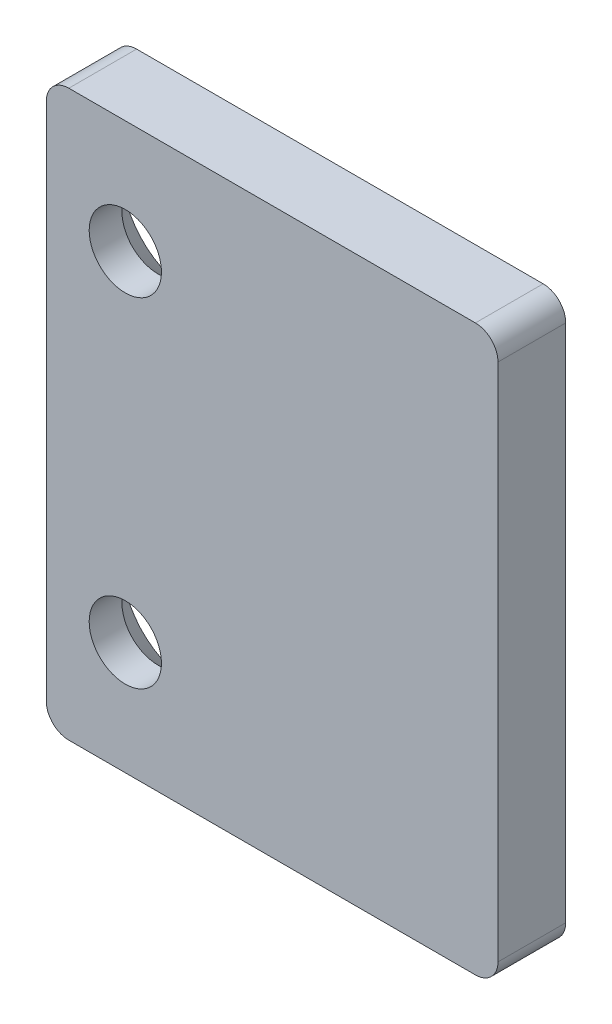
ISO-10303-21;
HEADER;
FILE_DESCRIPTION(('STEP AP214'),'2;1');
FILE_NAME('part.step','',(''),(''),'','','');
FILE_SCHEMA(('AUTOMOTIVE_DESIGN { 1 0 10303 214 1 1 1 1 }'));
ENDSEC;
DATA;
#1=APPLICATION_CONTEXT('core data for automotive mechanical design processes');
#2=APPLICATION_PROTOCOL_DEFINITION('international standard','automotive_design',2000,#1);
#3=PRODUCT_CONTEXT('',#1,'mechanical');
#4=PRODUCT('Part','Part','',(#3));
#5=PRODUCT_RELATED_PRODUCT_CATEGORY('part','',(#4));
#6=PRODUCT_DEFINITION_FORMATION('','',#4);
#7=PRODUCT_DEFINITION_CONTEXT('part definition',#1,'design');
#8=PRODUCT_DEFINITION('design','',#6,#7);
#9=PRODUCT_DEFINITION_SHAPE('','',#8);
#10=(LENGTH_UNIT() NAMED_UNIT(*) SI_UNIT(.MILLI.,.METRE.));
#11=(NAMED_UNIT(*) PLANE_ANGLE_UNIT() SI_UNIT($,.RADIAN.));
#12=(NAMED_UNIT(*) SI_UNIT($,.STERADIAN.) SOLID_ANGLE_UNIT());
#13=UNCERTAINTY_MEASURE_WITH_UNIT(LENGTH_MEASURE(1.E-05),#10,'distance_accuracy_value','');
#14=(GEOMETRIC_REPRESENTATION_CONTEXT(3) GLOBAL_UNCERTAINTY_ASSIGNED_CONTEXT((#13)) GLOBAL_UNIT_ASSIGNED_CONTEXT((#10,
#11,#12)) REPRESENTATION_CONTEXT('',''));
#15=CARTESIAN_POINT('',(0.,0.,0.));
#16=DIRECTION('',(0.,0.,1.));
#17=DIRECTION('',(1.,0.,0.));
#18=AXIS2_PLACEMENT_3D('',#15,#16,#17);
#19=CARTESIAN_POINT('',(0.,0.,3.));
#20=DIRECTION('',(0.,0.,-1.));
#21=DIRECTION('',(-1.,0.,0.));
#22=AXIS2_PLACEMENT_3D('',#19,#20,#21);
#23=PLANE('',#22);
#24=DIRECTION('',(-1.,0.,0.));
#25=VECTOR('',#24,1.);
#26=CARTESIAN_POINT('',(0.,25.,3.));
#27=LINE('',#26,#25);
#28=CARTESIAN_POINT('',(19.,25.,3.));
#29=VERTEX_POINT('',#28);
#30=CARTESIAN_POINT('',(1.,25.,3.));
#31=VERTEX_POINT('',#30);
#32=EDGE_CURVE('E136',#29,#31,#27,.T.);
#33=ORIENTED_EDGE('',*,*,#32,.T.);
#34=CARTESIAN_POINT('',(1.,24.,3.));
#35=DIRECTION('',(0.,0.,-1.));
#36=DIRECTION('',(-1.,0.,0.));
#37=AXIS2_PLACEMENT_3D('',#34,#35,#36);
#38=CIRCLE('',#37,1.);
#39=CARTESIAN_POINT('',(0.,24.,3.));
#40=VERTEX_POINT('',#39);
#41=EDGE_CURVE('E154',#31,#40,#38,.F.);
#42=ORIENTED_EDGE('',*,*,#41,.T.);
#43=DIRECTION('',(0.,-1.,0.));
#44=VECTOR('',#43,1.);
#45=CARTESIAN_POINT('',(0.,0.,3.));
#46=LINE('',#45,#44);
#47=CARTESIAN_POINT('',(0.,1.,3.));
#48=VERTEX_POINT('',#47);
#49=EDGE_CURVE('E119',#40,#48,#46,.T.);
#50=ORIENTED_EDGE('',*,*,#49,.T.);
#51=CARTESIAN_POINT('',(1.,1.,3.));
#52=DIRECTION('',(0.,0.,-1.));
#53=DIRECTION('',(-1.,0.,0.));
#54=AXIS2_PLACEMENT_3D('',#51,#52,#53);
#55=CIRCLE('',#54,1.);
#56=CARTESIAN_POINT('',(1.,0.,3.));
#57=VERTEX_POINT('',#56);
#58=EDGE_CURVE('E150',#48,#57,#55,.F.);
#59=ORIENTED_EDGE('',*,*,#58,.T.);
#60=DIRECTION('',(1.,0.,0.));
#61=VECTOR('',#60,1.);
#62=CARTESIAN_POINT('',(0.,0.,3.));
#63=LINE('',#62,#61);
#64=CARTESIAN_POINT('',(19.,0.,3.));
#65=VERTEX_POINT('',#64);
#66=EDGE_CURVE('E163',#57,#65,#63,.T.);
#67=ORIENTED_EDGE('',*,*,#66,.T.);
#68=CARTESIAN_POINT('',(19.,1.,3.));
#69=DIRECTION('',(0.,0.,-1.));
#70=DIRECTION('',(-1.,0.,0.));
#71=AXIS2_PLACEMENT_3D('',#68,#69,#70);
#72=CIRCLE('',#71,1.);
#73=CARTESIAN_POINT('',(20.,1.,3.));
#74=VERTEX_POINT('',#73);
#75=EDGE_CURVE('E54',#65,#74,#72,.F.);
#76=ORIENTED_EDGE('',*,*,#75,.T.);
#77=DIRECTION('',(0.,1.,0.));
#78=VECTOR('',#77,1.);
#79=CARTESIAN_POINT('',(20.,0.,3.));
#80=LINE('',#79,#78);
#81=CARTESIAN_POINT('',(20.,24.,3.));
#82=VERTEX_POINT('',#81);
#83=EDGE_CURVE('E169',#74,#82,#80,.T.);
#84=ORIENTED_EDGE('',*,*,#83,.T.);
#85=CARTESIAN_POINT('',(19.,24.,3.));
#86=DIRECTION('',(0.,0.,-1.));
#87=DIRECTION('',(-1.,0.,0.));
#88=AXIS2_PLACEMENT_3D('',#85,#86,#87);
#89=CIRCLE('',#88,1.);
#90=EDGE_CURVE('E152',#82,#29,#89,.F.);
#91=ORIENTED_EDGE('',*,*,#90,.T.);
#92=EDGE_LOOP('',(#33,#42,#50,#59,#67,#76,#84,#91));
#93=FACE_BOUND('',#92,.T.);
#94=CARTESIAN_POINT('',(3.5,5.,3.));
#95=DIRECTION('',(0.,0.,1.));
#96=DIRECTION('',(1.,0.,0.));
#97=AXIS2_PLACEMENT_3D('',#94,#95,#96);
#98=CIRCLE('',#97,1.6);
#99=CARTESIAN_POINT('',(5.1,5.,3.));
#100=VERTEX_POINT('',#99);
#101=EDGE_CURVE('E127',#100,#100,#98,.T.);
#102=ORIENTED_EDGE('',*,*,#101,.F.);
#103=EDGE_LOOP('',(#102));
#104=FACE_BOUND('',#103,.T.);
#105=CARTESIAN_POINT('',(3.5,20.,3.));
#106=DIRECTION('',(0.,0.,1.));
#107=DIRECTION('',(1.,0.,0.));
#108=AXIS2_PLACEMENT_3D('',#105,#106,#107);
#109=CIRCLE('',#108,1.6);
#110=CARTESIAN_POINT('',(5.1,20.,3.));
#111=VERTEX_POINT('',#110);
#112=EDGE_CURVE('E133',#111,#111,#109,.T.);
#113=ORIENTED_EDGE('',*,*,#112,.F.);
#114=EDGE_LOOP('',(#113));
#115=FACE_BOUND('',#114,.T.);
#116=ADVANCED_FACE('F32',(#93,#104,#115),#23,.F.);
#117=CARTESIAN_POINT('',(0.,0.,0.));
#118=DIRECTION('',(0.,0.,-1.));
#119=DIRECTION('',(-1.,0.,0.));
#120=AXIS2_PLACEMENT_3D('',#117,#118,#119);
#121=PLANE('',#120);
#122=CARTESIAN_POINT('',(3.5,20.,0.));
#123=DIRECTION('',(0.,0.,-1.));
#124=DIRECTION('',(-1.,0.,0.));
#125=AXIS2_PLACEMENT_3D('',#122,#123,#124);
#126=CIRCLE('',#125,3.15);
#127=CARTESIAN_POINT('',(0.350000000000001,20.,0.));
#128=VERTEX_POINT('',#127);
#129=EDGE_CURVE('E194',#128,#128,#126,.T.);
#130=ORIENTED_EDGE('',*,*,#129,.F.);
#131=EDGE_LOOP('',(#130));
#132=FACE_BOUND('',#131,.T.);
#133=CARTESIAN_POINT('',(3.5,5.,0.));
#134=DIRECTION('',(0.,0.,-1.));
#135=DIRECTION('',(-1.,0.,0.));
#136=AXIS2_PLACEMENT_3D('',#133,#134,#135);
#137=CIRCLE('',#136,3.15);
#138=CARTESIAN_POINT('',(0.350000000000004,5.,0.));
#139=VERTEX_POINT('',#138);
#140=EDGE_CURVE('E188',#139,#139,#137,.T.);
#141=ORIENTED_EDGE('',*,*,#140,.F.);
#142=EDGE_LOOP('',(#141));
#143=FACE_BOUND('',#142,.T.);
#144=DIRECTION('',(0.,-1.,0.));
#145=VECTOR('',#144,1.);
#146=CARTESIAN_POINT('',(0.,0.,0.));
#147=LINE('',#146,#145);
#148=CARTESIAN_POINT('',(0.,24.,0.));
#149=VERTEX_POINT('',#148);
#150=CARTESIAN_POINT('',(0.,1.,0.));
#151=VERTEX_POINT('',#150);
#152=EDGE_CURVE('E116',#149,#151,#147,.T.);
#153=ORIENTED_EDGE('',*,*,#152,.F.);
#154=CARTESIAN_POINT('',(1.,24.,0.));
#155=DIRECTION('',(0.,0.,-1.));
#156=DIRECTION('',(-1.,0.,0.));
#157=AXIS2_PLACEMENT_3D('',#154,#155,#156);
#158=CIRCLE('',#157,1.);
#159=CARTESIAN_POINT('',(1.,25.,0.));
#160=VERTEX_POINT('',#159);
#161=EDGE_CURVE('E99',#149,#160,#158,.T.);
#162=ORIENTED_EDGE('',*,*,#161,.T.);
#163=DIRECTION('',(-1.,0.,0.));
#164=VECTOR('',#163,1.);
#165=CARTESIAN_POINT('',(0.,25.,0.));
#166=LINE('',#165,#164);
#167=CARTESIAN_POINT('',(19.,25.,0.));
#168=VERTEX_POINT('',#167);
#169=EDGE_CURVE('E140',#168,#160,#166,.T.);
#170=ORIENTED_EDGE('',*,*,#169,.F.);
#171=CARTESIAN_POINT('',(19.,24.,0.));
#172=DIRECTION('',(0.,0.,-1.));
#173=DIRECTION('',(-1.,0.,0.));
#174=AXIS2_PLACEMENT_3D('',#171,#172,#173);
#175=CIRCLE('',#174,1.);
#176=CARTESIAN_POINT('',(20.,24.,0.));
#177=VERTEX_POINT('',#176);
#178=EDGE_CURVE('E110',#168,#177,#175,.T.);
#179=ORIENTED_EDGE('',*,*,#178,.T.);
#180=DIRECTION('',(0.,1.,0.));
#181=VECTOR('',#180,1.);
#182=CARTESIAN_POINT('',(20.,0.,0.));
#183=LINE('',#182,#181);
#184=CARTESIAN_POINT('',(20.,1.,0.));
#185=VERTEX_POINT('',#184);
#186=EDGE_CURVE('E130',#185,#177,#183,.T.);
#187=ORIENTED_EDGE('',*,*,#186,.F.);
#188=CARTESIAN_POINT('',(19.,1.,0.));
#189=DIRECTION('',(0.,0.,-1.));
#190=DIRECTION('',(-1.,0.,0.));
#191=AXIS2_PLACEMENT_3D('',#188,#189,#190);
#192=CIRCLE('',#191,1.);
#193=CARTESIAN_POINT('',(19.,0.,0.));
#194=VERTEX_POINT('',#193);
#195=EDGE_CURVE('E120',#185,#194,#192,.T.);
#196=ORIENTED_EDGE('',*,*,#195,.T.);
#197=DIRECTION('',(1.,0.,0.));
#198=VECTOR('',#197,1.);
#199=CARTESIAN_POINT('',(0.,0.,0.));
#200=LINE('',#199,#198);
#201=CARTESIAN_POINT('',(1.,0.,0.));
#202=VERTEX_POINT('',#201);
#203=EDGE_CURVE('E126',#202,#194,#200,.T.);
#204=ORIENTED_EDGE('',*,*,#203,.F.);
#205=CARTESIAN_POINT('',(1.,1.,0.));
#206=DIRECTION('',(0.,0.,-1.));
#207=DIRECTION('',(-1.,0.,0.));
#208=AXIS2_PLACEMENT_3D('',#205,#206,#207);
#209=CIRCLE('',#208,1.);
#210=EDGE_CURVE('E125',#202,#151,#209,.T.);
#211=ORIENTED_EDGE('',*,*,#210,.T.);
#212=EDGE_LOOP('',(#153,#162,#170,#179,#187,#196,#204,#211));
#213=FACE_BOUND('',#212,.T.);
#214=ADVANCED_FACE('F123',(#132,#143,#213),#121,.T.);
#215=CARTESIAN_POINT('',(0.,0.,3.));
#216=DIRECTION('',(1.,0.,0.));
#217=DIRECTION('',(0.,0.,-1.));
#218=AXIS2_PLACEMENT_3D('',#215,#216,#217);
#219=PLANE('',#218);
#220=ORIENTED_EDGE('',*,*,#49,.F.);
#221=DIRECTION('',(0.,0.,-1.));
#222=VECTOR('',#221,1.);
#223=CARTESIAN_POINT('',(0.,24.,3.));
#224=LINE('',#223,#222);
#225=EDGE_CURVE('E103',#40,#149,#224,.T.);
#226=ORIENTED_EDGE('',*,*,#225,.T.);
#227=ORIENTED_EDGE('',*,*,#152,.T.);
#228=DIRECTION('',(0.,0.,-1.));
#229=VECTOR('',#228,1.);
#230=CARTESIAN_POINT('',(0.,1.,3.));
#231=LINE('',#230,#229);
#232=EDGE_CURVE('E121',#151,#48,#231,.F.);
#233=ORIENTED_EDGE('',*,*,#232,.T.);
#234=EDGE_LOOP('',(#220,#226,#227,#233));
#235=FACE_BOUND('',#234,.T.);
#236=ADVANCED_FACE('F115',(#235),#219,.F.);
#237=CARTESIAN_POINT('',(0.,0.,3.));
#238=DIRECTION('',(0.,1.,0.));
#239=DIRECTION('',(0.,0.,1.));
#240=AXIS2_PLACEMENT_3D('',#237,#238,#239);
#241=PLANE('',#240);
#242=ORIENTED_EDGE('',*,*,#66,.F.);
#243=DIRECTION('',(0.,0.,-1.));
#244=VECTOR('',#243,1.);
#245=CARTESIAN_POINT('',(1.,0.,3.));
#246=LINE('',#245,#244);
#247=EDGE_CURVE('E11',#57,#202,#246,.T.);
#248=ORIENTED_EDGE('',*,*,#247,.T.);
#249=ORIENTED_EDGE('',*,*,#203,.T.);
#250=DIRECTION('',(0.,0.,-1.));
#251=VECTOR('',#250,1.);
#252=CARTESIAN_POINT('',(19.,0.,3.));
#253=LINE('',#252,#251);
#254=EDGE_CURVE('E40',#194,#65,#253,.F.);
#255=ORIENTED_EDGE('',*,*,#254,.T.);
#256=EDGE_LOOP('',(#242,#248,#249,#255));
#257=FACE_BOUND('',#256,.T.);
#258=ADVANCED_FACE('F162',(#257),#241,.F.);
#259=CARTESIAN_POINT('',(20.,0.,3.));
#260=DIRECTION('',(-1.,0.,0.));
#261=DIRECTION('',(0.,0.,1.));
#262=AXIS2_PLACEMENT_3D('',#259,#260,#261);
#263=PLANE('',#262);
#264=ORIENTED_EDGE('',*,*,#186,.T.);
#265=DIRECTION('',(0.,0.,-1.));
#266=VECTOR('',#265,1.);
#267=CARTESIAN_POINT('',(20.,24.,3.));
#268=LINE('',#267,#266);
#269=EDGE_CURVE('E47',#177,#82,#268,.F.);
#270=ORIENTED_EDGE('',*,*,#269,.T.);
#271=ORIENTED_EDGE('',*,*,#83,.F.);
#272=DIRECTION('',(0.,0.,-1.));
#273=VECTOR('',#272,1.);
#274=CARTESIAN_POINT('',(20.,1.,3.));
#275=LINE('',#274,#273);
#276=EDGE_CURVE('E156',#74,#185,#275,.T.);
#277=ORIENTED_EDGE('',*,*,#276,.T.);
#278=EDGE_LOOP('',(#264,#270,#271,#277));
#279=FACE_BOUND('',#278,.T.);
#280=ADVANCED_FACE('F173',(#279),#263,.F.);
#281=CARTESIAN_POINT('',(0.,25.,3.));
#282=DIRECTION('',(0.,-1.,0.));
#283=DIRECTION('',(0.,0.,-1.));
#284=AXIS2_PLACEMENT_3D('',#281,#282,#283);
#285=PLANE('',#284);
#286=ORIENTED_EDGE('',*,*,#169,.T.);
#287=DIRECTION('',(0.,0.,-1.));
#288=VECTOR('',#287,1.);
#289=CARTESIAN_POINT('',(1.,25.,3.));
#290=LINE('',#289,#288);
#291=EDGE_CURVE('E104',#160,#31,#290,.F.);
#292=ORIENTED_EDGE('',*,*,#291,.T.);
#293=ORIENTED_EDGE('',*,*,#32,.F.);
#294=DIRECTION('',(0.,0.,-1.));
#295=VECTOR('',#294,1.);
#296=CARTESIAN_POINT('',(19.,25.,3.));
#297=LINE('',#296,#295);
#298=EDGE_CURVE('E109',#29,#168,#297,.T.);
#299=ORIENTED_EDGE('',*,*,#298,.T.);
#300=EDGE_LOOP('',(#286,#292,#293,#299));
#301=FACE_BOUND('',#300,.T.);
#302=ADVANCED_FACE('F180',(#301),#285,.F.);
#303=CARTESIAN_POINT('',(3.5,5.,3.));
#304=DIRECTION('',(0.,0.,-1.));
#305=DIRECTION('',(-1.,0.,0.));
#306=AXIS2_PLACEMENT_3D('',#303,#304,#305);
#307=CYLINDRICAL_SURFACE('',#306,1.6);
#308=CARTESIAN_POINT('',(3.5,5.,1.55));
#309=DIRECTION('',(0.,0.,-1.));
#310=DIRECTION('',(-1.,0.,0.));
#311=AXIS2_PLACEMENT_3D('',#308,#309,#310);
#312=CIRCLE('',#311,1.6);
#313=CARTESIAN_POINT('',(1.9,5.,1.55));
#314=VERTEX_POINT('',#313);
#315=EDGE_CURVE('E185',#314,#314,#312,.F.);
#316=ORIENTED_EDGE('',*,*,#315,.F.);
#317=EDGE_LOOP('',(#316));
#318=FACE_BOUND('',#317,.T.);
#319=ORIENTED_EDGE('',*,*,#101,.T.);
#320=EDGE_LOOP('',(#319));
#321=FACE_BOUND('',#320,.T.);
#322=ADVANCED_FACE('F222',(#318,#321),#307,.F.);
#323=CARTESIAN_POINT('',(3.5,20.,3.));
#324=DIRECTION('',(0.,0.,-1.));
#325=DIRECTION('',(-1.,0.,0.));
#326=AXIS2_PLACEMENT_3D('',#323,#324,#325);
#327=CYLINDRICAL_SURFACE('',#326,1.6);
#328=CARTESIAN_POINT('',(3.5,20.,1.55));
#329=DIRECTION('',(0.,0.,-1.));
#330=DIRECTION('',(-1.,0.,0.));
#331=AXIS2_PLACEMENT_3D('',#328,#329,#330);
#332=CIRCLE('',#331,1.6);
#333=CARTESIAN_POINT('',(1.9,20.,1.55));
#334=VERTEX_POINT('',#333);
#335=EDGE_CURVE('E191',#334,#334,#332,.F.);
#336=ORIENTED_EDGE('',*,*,#335,.F.);
#337=EDGE_LOOP('',(#336));
#338=FACE_BOUND('',#337,.T.);
#339=ORIENTED_EDGE('',*,*,#112,.T.);
#340=EDGE_LOOP('',(#339));
#341=FACE_BOUND('',#340,.T.);
#342=ADVANCED_FACE('F234',(#338,#341),#327,.F.);
#343=CARTESIAN_POINT('',(1.,24.,3.));
#344=DIRECTION('',(0.,0.,-1.));
#345=DIRECTION('',(-1.,0.,0.));
#346=AXIS2_PLACEMENT_3D('',#343,#344,#345);
#347=CYLINDRICAL_SURFACE('',#346,1.);
#348=ORIENTED_EDGE('',*,*,#41,.F.);
#349=ORIENTED_EDGE('',*,*,#291,.F.);
#350=ORIENTED_EDGE('',*,*,#161,.F.);
#351=ORIENTED_EDGE('',*,*,#225,.F.);
#352=EDGE_LOOP('',(#348,#349,#350,#351));
#353=FACE_BOUND('',#352,.T.);
#354=ADVANCED_FACE('F102',(#353),#347,.T.);
#355=CARTESIAN_POINT('',(19.,24.,3.));
#356=DIRECTION('',(0.,0.,-1.));
#357=DIRECTION('',(-1.,0.,0.));
#358=AXIS2_PLACEMENT_3D('',#355,#356,#357);
#359=CYLINDRICAL_SURFACE('',#358,1.);
#360=ORIENTED_EDGE('',*,*,#90,.F.);
#361=ORIENTED_EDGE('',*,*,#269,.F.);
#362=ORIENTED_EDGE('',*,*,#178,.F.);
#363=ORIENTED_EDGE('',*,*,#298,.F.);
#364=EDGE_LOOP('',(#360,#361,#362,#363));
#365=FACE_BOUND('',#364,.T.);
#366=ADVANCED_FACE('F177',(#365),#359,.T.);
#367=CARTESIAN_POINT('',(1.,1.,3.));
#368=DIRECTION('',(0.,0.,-1.));
#369=DIRECTION('',(-1.,0.,0.));
#370=AXIS2_PLACEMENT_3D('',#367,#368,#369);
#371=CYLINDRICAL_SURFACE('',#370,1.);
#372=ORIENTED_EDGE('',*,*,#58,.F.);
#373=ORIENTED_EDGE('',*,*,#232,.F.);
#374=ORIENTED_EDGE('',*,*,#210,.F.);
#375=ORIENTED_EDGE('',*,*,#247,.F.);
#376=EDGE_LOOP('',(#372,#373,#374,#375));
#377=FACE_BOUND('',#376,.T.);
#378=ADVANCED_FACE('F215',(#377),#371,.T.);
#379=CARTESIAN_POINT('',(19.,1.,3.));
#380=DIRECTION('',(0.,0.,-1.));
#381=DIRECTION('',(-1.,0.,0.));
#382=AXIS2_PLACEMENT_3D('',#379,#380,#381);
#383=CYLINDRICAL_SURFACE('',#382,1.);
#384=ORIENTED_EDGE('',*,*,#75,.F.);
#385=ORIENTED_EDGE('',*,*,#254,.F.);
#386=ORIENTED_EDGE('',*,*,#195,.F.);
#387=ORIENTED_EDGE('',*,*,#276,.F.);
#388=EDGE_LOOP('',(#384,#385,#386,#387));
#389=FACE_BOUND('',#388,.T.);
#390=ADVANCED_FACE('F34',(#389),#383,.T.);
#391=CARTESIAN_POINT('',(3.5,5.,0.));
#392=DIRECTION('',(0.,0.,-1.));
#393=DIRECTION('',(-1.,0.,0.));
#394=AXIS2_PLACEMENT_3D('',#391,#392,#393);
#395=CONICAL_SURFACE('',#394,3.15,0.785398163397448);
#396=ORIENTED_EDGE('',*,*,#315,.T.);
#397=EDGE_LOOP('',(#396));
#398=FACE_BOUND('',#397,.T.);
#399=ORIENTED_EDGE('',*,*,#140,.T.);
#400=EDGE_LOOP('',(#399));
#401=FACE_BOUND('',#400,.T.);
#402=ADVANCED_FACE('F205',(#398,#401),#395,.F.);
#403=CARTESIAN_POINT('',(3.5,20.,0.));
#404=DIRECTION('',(0.,0.,-1.));
#405=DIRECTION('',(-1.,0.,0.));
#406=AXIS2_PLACEMENT_3D('',#403,#404,#405);
#407=CONICAL_SURFACE('',#406,3.15,0.785398163397448);
#408=ORIENTED_EDGE('',*,*,#335,.T.);
#409=EDGE_LOOP('',(#408));
#410=FACE_BOUND('',#409,.T.);
#411=ORIENTED_EDGE('',*,*,#129,.T.);
#412=EDGE_LOOP('',(#411));
#413=FACE_BOUND('',#412,.T.);
#414=ADVANCED_FACE('F198',(#410,#413),#407,.F.);
#415=CLOSED_SHELL('',(#116,#214,#236,#258,#280,#302,#322,#342,#354,#366,#378,#390,#402,#414));
#416=MANIFOLD_SOLID_BREP('B2',#415);
#417=ADVANCED_BREP_SHAPE_REPRESENTATION('',(#18,#416),#14);
#418=SHAPE_DEFINITION_REPRESENTATION(#9,#417);
ENDSEC;
END-ISO-10303-21;
